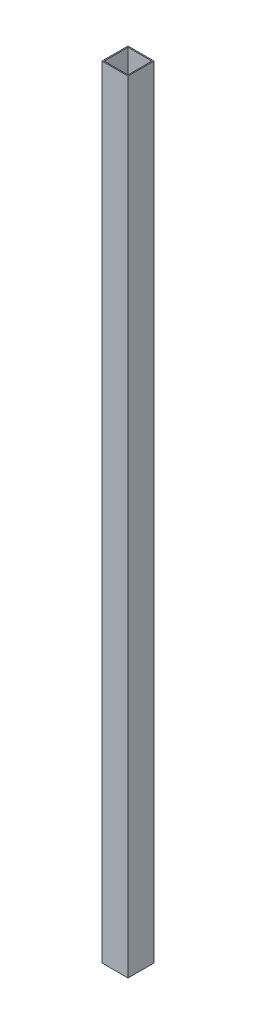
ISO-10303-21;
HEADER;
FILE_DESCRIPTION(('STEP AP214'),'2;1');
FILE_NAME('part.step','',(''),(''),'','','');
FILE_SCHEMA(('AUTOMOTIVE_DESIGN { 1 0 10303 214 1 1 1 1 }'));
ENDSEC;
DATA;
#1=APPLICATION_CONTEXT('core data for automotive mechanical design processes');
#2=APPLICATION_PROTOCOL_DEFINITION('international standard','automotive_design',2000,#1);
#3=PRODUCT_CONTEXT('',#1,'mechanical');
#4=PRODUCT('Part','Part','',(#3));
#5=PRODUCT_RELATED_PRODUCT_CATEGORY('part','',(#4));
#6=PRODUCT_DEFINITION_FORMATION('','',#4);
#7=PRODUCT_DEFINITION_CONTEXT('part definition',#1,'design');
#8=PRODUCT_DEFINITION('design','',#6,#7);
#9=PRODUCT_DEFINITION_SHAPE('','',#8);
#10=(LENGTH_UNIT() NAMED_UNIT(*) SI_UNIT(.MILLI.,.METRE.));
#11=(NAMED_UNIT(*) PLANE_ANGLE_UNIT() SI_UNIT($,.RADIAN.));
#12=(NAMED_UNIT(*) SI_UNIT($,.STERADIAN.) SOLID_ANGLE_UNIT());
#13=UNCERTAINTY_MEASURE_WITH_UNIT(LENGTH_MEASURE(1.E-05),#10,'distance_accuracy_value','');
#14=(GEOMETRIC_REPRESENTATION_CONTEXT(3) GLOBAL_UNCERTAINTY_ASSIGNED_CONTEXT((#13)) GLOBAL_UNIT_ASSIGNED_CONTEXT((#10,
#11,#12)) REPRESENTATION_CONTEXT('',''));
#15=CARTESIAN_POINT('',(0.,0.,0.));
#16=DIRECTION('',(0.,0.,1.));
#17=DIRECTION('',(1.,0.,0.));
#18=AXIS2_PLACEMENT_3D('',#15,#16,#17);
#19=CARTESIAN_POINT('',(0.,750.,0.));
#20=DIRECTION('',(0.,1.,0.));
#21=DIRECTION('',(0.,0.,1.));
#22=AXIS2_PLACEMENT_3D('',#19,#20,#21);
#23=PLANE('',#22);
#24=DIRECTION('',(0.,0.,1.));
#25=VECTOR('',#24,1.);
#26=CARTESIAN_POINT('',(-12.5,750.,12.5));
#27=LINE('',#26,#25);
#28=CARTESIAN_POINT('',(-12.5,750.,-12.5));
#29=VERTEX_POINT('',#28);
#30=CARTESIAN_POINT('',(-12.5,750.,12.5));
#31=VERTEX_POINT('',#30);
#32=EDGE_CURVE('E142',#29,#31,#27,.T.);
#33=ORIENTED_EDGE('',*,*,#32,.T.);
#34=DIRECTION('',(1.,0.,0.));
#35=VECTOR('',#34,1.);
#36=CARTESIAN_POINT('',(12.5,750.,12.5));
#37=LINE('',#36,#35);
#38=CARTESIAN_POINT('',(12.5,750.,12.5));
#39=VERTEX_POINT('',#38);
#40=EDGE_CURVE('E145',#31,#39,#37,.T.);
#41=ORIENTED_EDGE('',*,*,#40,.T.);
#42=DIRECTION('',(0.,0.,-1.));
#43=VECTOR('',#42,1.);
#44=CARTESIAN_POINT('',(12.5,750.,12.5));
#45=LINE('',#44,#43);
#46=CARTESIAN_POINT('',(12.5,750.,-12.5));
#47=VERTEX_POINT('',#46);
#48=EDGE_CURVE('E148',#39,#47,#45,.T.);
#49=ORIENTED_EDGE('',*,*,#48,.T.);
#50=DIRECTION('',(-1.,0.,0.));
#51=VECTOR('',#50,1.);
#52=CARTESIAN_POINT('',(12.5,750.,-12.5));
#53=LINE('',#52,#51);
#54=EDGE_CURVE('E150',#47,#29,#53,.T.);
#55=ORIENTED_EDGE('',*,*,#54,.T.);
#56=EDGE_LOOP('',(#33,#41,#49,#55));
#57=FACE_BOUND('',#56,.T.);
#58=DIRECTION('',(1.,0.,0.));
#59=VECTOR('',#58,1.);
#60=CARTESIAN_POINT('',(11.5,750.,11.5));
#61=LINE('',#60,#59);
#62=CARTESIAN_POINT('',(-11.5,750.,11.5));
#63=VERTEX_POINT('',#62);
#64=CARTESIAN_POINT('',(11.5,750.,11.5));
#65=VERTEX_POINT('',#64);
#66=EDGE_CURVE('E114',#63,#65,#61,.T.);
#67=ORIENTED_EDGE('',*,*,#66,.F.);
#68=DIRECTION('',(0.,0.,1.));
#69=VECTOR('',#68,1.);
#70=CARTESIAN_POINT('',(-11.5,750.,11.5));
#71=LINE('',#70,#69);
#72=CARTESIAN_POINT('',(-11.5,750.,-11.5));
#73=VERTEX_POINT('',#72);
#74=EDGE_CURVE('E106',#73,#63,#71,.T.);
#75=ORIENTED_EDGE('',*,*,#74,.F.);
#76=DIRECTION('',(-1.,0.,0.));
#77=VECTOR('',#76,1.);
#78=CARTESIAN_POINT('',(11.5,750.,-11.5));
#79=LINE('',#78,#77);
#80=CARTESIAN_POINT('',(11.5,750.,-11.5));
#81=VERTEX_POINT('',#80);
#82=EDGE_CURVE('E128',#81,#73,#79,.T.);
#83=ORIENTED_EDGE('',*,*,#82,.F.);
#84=DIRECTION('',(0.,0.,-1.));
#85=VECTOR('',#84,1.);
#86=CARTESIAN_POINT('',(11.5,750.,11.5));
#87=LINE('',#86,#85);
#88=EDGE_CURVE('E126',#65,#81,#87,.T.);
#89=ORIENTED_EDGE('',*,*,#88,.F.);
#90=EDGE_LOOP('',(#67,#75,#83,#89));
#91=FACE_BOUND('',#90,.T.);
#92=ADVANCED_FACE('F41',(#57,#91),#23,.T.);
#93=CARTESIAN_POINT('',(0.,0.,0.));
#94=DIRECTION('',(0.,1.,0.));
#95=DIRECTION('',(0.,0.,1.));
#96=AXIS2_PLACEMENT_3D('',#93,#94,#95);
#97=PLANE('',#96);
#98=DIRECTION('',(0.,0.,1.));
#99=VECTOR('',#98,1.);
#100=CARTESIAN_POINT('',(-12.5,0.,12.5));
#101=LINE('',#100,#99);
#102=CARTESIAN_POINT('',(-12.5,0.,-12.5));
#103=VERTEX_POINT('',#102);
#104=CARTESIAN_POINT('',(-12.5,0.,12.5));
#105=VERTEX_POINT('',#104);
#106=EDGE_CURVE('E122',#103,#105,#101,.T.);
#107=ORIENTED_EDGE('',*,*,#106,.F.);
#108=DIRECTION('',(-1.,0.,0.));
#109=VECTOR('',#108,1.);
#110=CARTESIAN_POINT('',(12.5,0.,-12.5));
#111=LINE('',#110,#109);
#112=CARTESIAN_POINT('',(12.5,0.,-12.5));
#113=VERTEX_POINT('',#112);
#114=EDGE_CURVE('E146',#113,#103,#111,.T.);
#115=ORIENTED_EDGE('',*,*,#114,.F.);
#116=DIRECTION('',(0.,0.,-1.));
#117=VECTOR('',#116,1.);
#118=CARTESIAN_POINT('',(12.5,0.,12.5));
#119=LINE('',#118,#117);
#120=CARTESIAN_POINT('',(12.5,0.,12.5));
#121=VERTEX_POINT('',#120);
#122=EDGE_CURVE('E157',#121,#113,#119,.T.);
#123=ORIENTED_EDGE('',*,*,#122,.F.);
#124=DIRECTION('',(1.,0.,0.));
#125=VECTOR('',#124,1.);
#126=CARTESIAN_POINT('',(12.5,0.,12.5));
#127=LINE('',#126,#125);
#128=EDGE_CURVE('E155',#105,#121,#127,.T.);
#129=ORIENTED_EDGE('',*,*,#128,.F.);
#130=EDGE_LOOP('',(#107,#115,#123,#129));
#131=FACE_BOUND('',#130,.T.);
#132=DIRECTION('',(0.,0.,1.));
#133=VECTOR('',#132,1.);
#134=CARTESIAN_POINT('',(-11.5,0.,11.5));
#135=LINE('',#134,#133);
#136=CARTESIAN_POINT('',(-11.5,0.,-11.5));
#137=VERTEX_POINT('',#136);
#138=CARTESIAN_POINT('',(-11.5,0.,11.5));
#139=VERTEX_POINT('',#138);
#140=EDGE_CURVE('E64',#137,#139,#135,.T.);
#141=ORIENTED_EDGE('',*,*,#140,.T.);
#142=DIRECTION('',(1.,0.,0.));
#143=VECTOR('',#142,1.);
#144=CARTESIAN_POINT('',(11.5,0.,11.5));
#145=LINE('',#144,#143);
#146=CARTESIAN_POINT('',(11.5,0.,11.5));
#147=VERTEX_POINT('',#146);
#148=EDGE_CURVE('E121',#139,#147,#145,.T.);
#149=ORIENTED_EDGE('',*,*,#148,.T.);
#150=DIRECTION('',(0.,0.,-1.));
#151=VECTOR('',#150,1.);
#152=CARTESIAN_POINT('',(11.5,0.,11.5));
#153=LINE('',#152,#151);
#154=CARTESIAN_POINT('',(11.5,0.,-11.5));
#155=VERTEX_POINT('',#154);
#156=EDGE_CURVE('E134',#147,#155,#153,.T.);
#157=ORIENTED_EDGE('',*,*,#156,.T.);
#158=DIRECTION('',(-1.,0.,0.));
#159=VECTOR('',#158,1.);
#160=CARTESIAN_POINT('',(11.5,0.,-11.5));
#161=LINE('',#160,#159);
#162=EDGE_CURVE('E115',#155,#137,#161,.T.);
#163=ORIENTED_EDGE('',*,*,#162,.T.);
#164=EDGE_LOOP('',(#141,#149,#157,#163));
#165=FACE_BOUND('',#164,.T.);
#166=ADVANCED_FACE('F175',(#131,#165),#97,.F.);
#167=CARTESIAN_POINT('',(-12.5,750.,12.5));
#168=DIRECTION('',(1.,0.,0.));
#169=DIRECTION('',(0.,0.,-1.));
#170=AXIS2_PLACEMENT_3D('',#167,#168,#169);
#171=PLANE('',#170);
#172=ORIENTED_EDGE('',*,*,#106,.T.);
#173=DIRECTION('',(0.,-1.,0.));
#174=VECTOR('',#173,1.);
#175=CARTESIAN_POINT('',(-12.5,750.,12.5));
#176=LINE('',#175,#174);
#177=EDGE_CURVE('E11',#31,#105,#176,.T.);
#178=ORIENTED_EDGE('',*,*,#177,.F.);
#179=ORIENTED_EDGE('',*,*,#32,.F.);
#180=DIRECTION('',(0.,-1.,0.));
#181=VECTOR('',#180,1.);
#182=CARTESIAN_POINT('',(-12.5,750.,-12.5));
#183=LINE('',#182,#181);
#184=EDGE_CURVE('E152',#29,#103,#183,.T.);
#185=ORIENTED_EDGE('',*,*,#184,.T.);
#186=EDGE_LOOP('',(#172,#178,#179,#185));
#187=FACE_BOUND('',#186,.T.);
#188=ADVANCED_FACE('F43',(#187),#171,.F.);
#189=CARTESIAN_POINT('',(12.5,750.,12.5));
#190=DIRECTION('',(0.,0.,-1.));
#191=DIRECTION('',(-1.,0.,0.));
#192=AXIS2_PLACEMENT_3D('',#189,#190,#191);
#193=PLANE('',#192);
#194=ORIENTED_EDGE('',*,*,#128,.T.);
#195=DIRECTION('',(0.,-1.,0.));
#196=VECTOR('',#195,1.);
#197=CARTESIAN_POINT('',(12.5,750.,12.5));
#198=LINE('',#197,#196);
#199=EDGE_CURVE('E49',#39,#121,#198,.T.);
#200=ORIENTED_EDGE('',*,*,#199,.F.);
#201=ORIENTED_EDGE('',*,*,#40,.F.);
#202=ORIENTED_EDGE('',*,*,#177,.T.);
#203=EDGE_LOOP('',(#194,#200,#201,#202));
#204=FACE_BOUND('',#203,.T.);
#205=ADVANCED_FACE('F185',(#204),#193,.F.);
#206=CARTESIAN_POINT('',(12.5,750.,12.5));
#207=DIRECTION('',(-1.,0.,0.));
#208=DIRECTION('',(0.,0.,1.));
#209=AXIS2_PLACEMENT_3D('',#206,#207,#208);
#210=PLANE('',#209);
#211=ORIENTED_EDGE('',*,*,#122,.T.);
#212=DIRECTION('',(0.,-1.,0.));
#213=VECTOR('',#212,1.);
#214=CARTESIAN_POINT('',(12.5,750.,-12.5));
#215=LINE('',#214,#213);
#216=EDGE_CURVE('E162',#47,#113,#215,.T.);
#217=ORIENTED_EDGE('',*,*,#216,.F.);
#218=ORIENTED_EDGE('',*,*,#48,.F.);
#219=ORIENTED_EDGE('',*,*,#199,.T.);
#220=EDGE_LOOP('',(#211,#217,#218,#219));
#221=FACE_BOUND('',#220,.T.);
#222=ADVANCED_FACE('F169',(#221),#210,.F.);
#223=CARTESIAN_POINT('',(12.5,750.,-12.5));
#224=DIRECTION('',(0.,0.,1.));
#225=DIRECTION('',(1.,0.,0.));
#226=AXIS2_PLACEMENT_3D('',#223,#224,#225);
#227=PLANE('',#226);
#228=ORIENTED_EDGE('',*,*,#114,.T.);
#229=ORIENTED_EDGE('',*,*,#184,.F.);
#230=ORIENTED_EDGE('',*,*,#54,.F.);
#231=ORIENTED_EDGE('',*,*,#216,.T.);
#232=EDGE_LOOP('',(#228,#229,#230,#231));
#233=FACE_BOUND('',#232,.T.);
#234=ADVANCED_FACE('F179',(#233),#227,.F.);
#235=CARTESIAN_POINT('',(-11.5,750.,11.5));
#236=DIRECTION('',(1.,0.,0.));
#237=DIRECTION('',(0.,0.,-1.));
#238=AXIS2_PLACEMENT_3D('',#235,#236,#237);
#239=PLANE('',#238);
#240=ORIENTED_EDGE('',*,*,#140,.F.);
#241=DIRECTION('',(0.,-1.,0.));
#242=VECTOR('',#241,1.);
#243=CARTESIAN_POINT('',(-11.5,750.,-11.5));
#244=LINE('',#243,#242);
#245=EDGE_CURVE('E110',#73,#137,#244,.T.);
#246=ORIENTED_EDGE('',*,*,#245,.F.);
#247=ORIENTED_EDGE('',*,*,#74,.T.);
#248=DIRECTION('',(0.,-1.,0.));
#249=VECTOR('',#248,1.);
#250=CARTESIAN_POINT('',(-11.5,750.,11.5));
#251=LINE('',#250,#249);
#252=EDGE_CURVE('E109',#63,#139,#251,.T.);
#253=ORIENTED_EDGE('',*,*,#252,.T.);
#254=EDGE_LOOP('',(#240,#246,#247,#253));
#255=FACE_BOUND('',#254,.T.);
#256=ADVANCED_FACE('F108',(#255),#239,.T.);
#257=CARTESIAN_POINT('',(11.5,750.,11.5));
#258=DIRECTION('',(0.,0.,-1.));
#259=DIRECTION('',(-1.,0.,0.));
#260=AXIS2_PLACEMENT_3D('',#257,#258,#259);
#261=PLANE('',#260);
#262=ORIENTED_EDGE('',*,*,#148,.F.);
#263=ORIENTED_EDGE('',*,*,#252,.F.);
#264=ORIENTED_EDGE('',*,*,#66,.T.);
#265=DIRECTION('',(0.,-1.,0.));
#266=VECTOR('',#265,1.);
#267=CARTESIAN_POINT('',(11.5,750.,11.5));
#268=LINE('',#267,#266);
#269=EDGE_CURVE('E123',#65,#147,#268,.T.);
#270=ORIENTED_EDGE('',*,*,#269,.T.);
#271=EDGE_LOOP('',(#262,#263,#264,#270));
#272=FACE_BOUND('',#271,.T.);
#273=ADVANCED_FACE('F118',(#272),#261,.T.);
#274=CARTESIAN_POINT('',(11.5,750.,11.5));
#275=DIRECTION('',(-1.,0.,0.));
#276=DIRECTION('',(0.,0.,1.));
#277=AXIS2_PLACEMENT_3D('',#274,#275,#276);
#278=PLANE('',#277);
#279=ORIENTED_EDGE('',*,*,#156,.F.);
#280=ORIENTED_EDGE('',*,*,#269,.F.);
#281=ORIENTED_EDGE('',*,*,#88,.T.);
#282=DIRECTION('',(0.,-1.,0.));
#283=VECTOR('',#282,1.);
#284=CARTESIAN_POINT('',(11.5,750.,-11.5));
#285=LINE('',#284,#283);
#286=EDGE_CURVE('E56',#81,#155,#285,.T.);
#287=ORIENTED_EDGE('',*,*,#286,.T.);
#288=EDGE_LOOP('',(#279,#280,#281,#287));
#289=FACE_BOUND('',#288,.T.);
#290=ADVANCED_FACE('F208',(#289),#278,.T.);
#291=CARTESIAN_POINT('',(11.5,750.,-11.5));
#292=DIRECTION('',(0.,0.,1.));
#293=DIRECTION('',(1.,0.,0.));
#294=AXIS2_PLACEMENT_3D('',#291,#292,#293);
#295=PLANE('',#294);
#296=ORIENTED_EDGE('',*,*,#162,.F.);
#297=ORIENTED_EDGE('',*,*,#286,.F.);
#298=ORIENTED_EDGE('',*,*,#82,.T.);
#299=ORIENTED_EDGE('',*,*,#245,.T.);
#300=EDGE_LOOP('',(#296,#297,#298,#299));
#301=FACE_BOUND('',#300,.T.);
#302=ADVANCED_FACE('F212',(#301),#295,.T.);
#303=CLOSED_SHELL('',(#92,#166,#188,#205,#222,#234,#256,#273,#290,#302));
#304=MANIFOLD_SOLID_BREP('B2',#303);
#305=ADVANCED_BREP_SHAPE_REPRESENTATION('',(#18,#304),#14);
#306=SHAPE_DEFINITION_REPRESENTATION(#9,#305);
ENDSEC;
END-ISO-10303-21;
